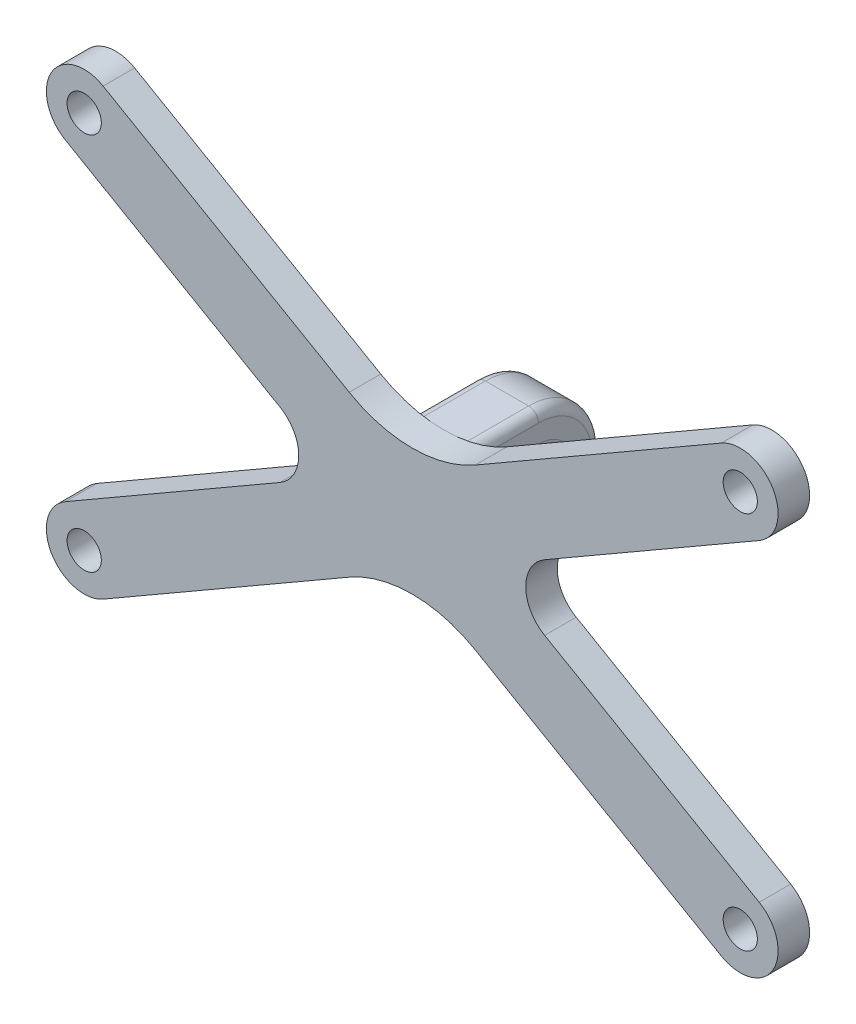
ISO-10303-21;
HEADER;
FILE_DESCRIPTION(('STEP AP214'),'2;1');
FILE_NAME('part.step','',(''),(''),'','','');
FILE_SCHEMA(('AUTOMOTIVE_DESIGN { 1 0 10303 214 1 1 1 1 }'));
ENDSEC;
DATA;
#1=APPLICATION_CONTEXT('core data for automotive mechanical design processes');
#2=APPLICATION_PROTOCOL_DEFINITION('international standard','automotive_design',2000,#1);
#3=PRODUCT_CONTEXT('',#1,'mechanical');
#4=PRODUCT('Part','Part','',(#3));
#5=PRODUCT_RELATED_PRODUCT_CATEGORY('part','',(#4));
#6=PRODUCT_DEFINITION_FORMATION('','',#4);
#7=PRODUCT_DEFINITION_CONTEXT('part definition',#1,'design');
#8=PRODUCT_DEFINITION('design','',#6,#7);
#9=PRODUCT_DEFINITION_SHAPE('','',#8);
#10=(LENGTH_UNIT() NAMED_UNIT(*) SI_UNIT(.MILLI.,.METRE.));
#11=(NAMED_UNIT(*) PLANE_ANGLE_UNIT() SI_UNIT($,.RADIAN.));
#12=(NAMED_UNIT(*) SI_UNIT($,.STERADIAN.) SOLID_ANGLE_UNIT());
#13=UNCERTAINTY_MEASURE_WITH_UNIT(LENGTH_MEASURE(1.E-05),#10,'distance_accuracy_value','');
#14=(GEOMETRIC_REPRESENTATION_CONTEXT(3) GLOBAL_UNCERTAINTY_ASSIGNED_CONTEXT((#13)) GLOBAL_UNIT_ASSIGNED_CONTEXT((#10,
#11,#12)) REPRESENTATION_CONTEXT('',''));
#15=CARTESIAN_POINT('',(0.,0.,0.));
#16=DIRECTION('',(0.,0.,1.));
#17=DIRECTION('',(1.,0.,0.));
#18=AXIS2_PLACEMENT_3D('',#15,#16,#17);
#19=CARTESIAN_POINT('',(33.0388691543761,19.0750000000004,-24.175));
#20=DIRECTION('',(0.,0.,-1.));
#21=DIRECTION('',(-1.,0.,0.));
#22=AXIS2_PLACEMENT_3D('',#19,#20,#21);
#23=PLANE('',#22);
#24=DIRECTION('',(-1.,0.,0.));
#25=VECTOR('',#24,1.);
#26=CARTESIAN_POINT('',(3.175,-6.36410588864129,-24.175));
#27=LINE('',#26,#25);
#28=CARTESIAN_POINT('',(1.07552855510562E-13,-6.36410588864129,-24.175));
#29=VERTEX_POINT('',#28);
#30=CARTESIAN_POINT('',(-2.175,-6.36410588864129,-24.175));
#31=VERTEX_POINT('',#30);
#32=EDGE_CURVE('E219',#29,#31,#27,.T.);
#33=ORIENTED_EDGE('',*,*,#32,.F.);
#34=CARTESIAN_POINT('',(1.07552855510562E-13,-19.0641058886413,-24.175));
#35=DIRECTION('',(0.,0.,-1.));
#36=DIRECTION('',(-1.,0.,0.));
#37=AXIS2_PLACEMENT_3D('',#34,#35,#36);
#38=CIRCLE('',#37,12.7);
#39=CARTESIAN_POINT('',(-6.34999999999999,-8.06558326057897,-24.175));
#40=VERTEX_POINT('',#39);
#41=EDGE_CURVE('E233',#29,#40,#38,.F.);
#42=ORIENTED_EDGE('',*,*,#41,.T.);
#43=DIRECTION('',(-0.866025403784434,-0.500000000000008,0.));
#44=VECTOR('',#43,1.);
#45=CARTESIAN_POINT('',(0.,-4.39940905122478,-24.175));
#46=LINE('',#45,#44);
#47=CARTESIAN_POINT('',(-31.133869154376,-22.3745567884194,-24.175));
#48=VERTEX_POINT('',#47);
#49=EDGE_CURVE('E515',#40,#48,#46,.T.);
#50=ORIENTED_EDGE('',*,*,#49,.T.);
#51=CARTESIAN_POINT('',(-33.0388691543763,-19.0750000000002,-24.175));
#52=DIRECTION('',(0.,0.,-1.));
#53=DIRECTION('',(-1.,0.,0.));
#54=AXIS2_PLACEMENT_3D('',#51,#52,#53);
#55=CIRCLE('',#54,3.81000000000056);
#56=CARTESIAN_POINT('',(-34.9438691543767,-15.7754432115804,-24.175));
#57=VERTEX_POINT('',#56);
#58=EDGE_CURVE('E512',#48,#57,#55,.T.);
#59=ORIENTED_EDGE('',*,*,#58,.T.);
#60=DIRECTION('',(0.866025403784449,0.499999999999982,0.));
#61=VECTOR('',#60,1.);
#62=CARTESIAN_POINT('',(-7.62000000000017,2.14840589410959E-13,-24.175));
#63=LINE('',#62,#61);
#64=CARTESIAN_POINT('',(-13.3350000000004,-3.29955678841848,-24.175));
#65=VERTEX_POINT('',#64);
#66=EDGE_CURVE('E509',#57,#65,#63,.T.);
#67=ORIENTED_EDGE('',*,*,#66,.T.);
#68=CARTESIAN_POINT('',(-15.2400000000004,2.72785266597353E-13,-24.175));
#69=DIRECTION('',(0.,0.,-1.));
#70=DIRECTION('',(-1.,0.,0.));
#71=AXIS2_PLACEMENT_3D('',#68,#69,#70);
#72=CIRCLE('',#71,3.81);
#73=CARTESIAN_POINT('',(-13.3350000000004,3.299556788419,-24.175));
#74=VERTEX_POINT('',#73);
#75=EDGE_CURVE('E373',#65,#74,#72,.F.);
#76=ORIENTED_EDGE('',*,*,#75,.T.);
#77=DIRECTION('',(-0.866025403784442,0.499999999999995,0.));
#78=VECTOR('',#77,1.);
#79=CARTESIAN_POINT('',(-7.62000000000017,2.14840589410959E-13,-24.175));
#80=LINE('',#79,#78);
#81=CARTESIAN_POINT('',(-34.9438691543764,15.7754432115812,-24.175));
#82=VERTEX_POINT('',#81);
#83=EDGE_CURVE('E506',#74,#82,#80,.T.);
#84=ORIENTED_EDGE('',*,*,#83,.T.);
#85=CARTESIAN_POINT('',(-33.0388691543764,19.0749999999999,-24.175));
#86=DIRECTION('',(0.,0.,-1.));
#87=DIRECTION('',(-1.,0.,0.));
#88=AXIS2_PLACEMENT_3D('',#85,#86,#87);
#89=CIRCLE('',#88,3.81);
#90=CARTESIAN_POINT('',(-31.1338691543765,22.3745567884187,-24.175));
#91=VERTEX_POINT('',#90);
#92=EDGE_CURVE('E503',#82,#91,#89,.T.);
#93=ORIENTED_EDGE('',*,*,#92,.T.);
#94=DIRECTION('',(0.866025403784442,-0.499999999999995,0.));
#95=VECTOR('',#94,1.);
#96=CARTESIAN_POINT('',(0.,4.39940905122509,-24.175));
#97=LINE('',#96,#95);
#98=CARTESIAN_POINT('',(-6.34999999999983,8.06558326057906,-24.175));
#99=VERTEX_POINT('',#98);
#100=EDGE_CURVE('E354',#91,#99,#97,.T.);
#101=ORIENTED_EDGE('',*,*,#100,.T.);
#102=CARTESIAN_POINT('',(1.07552855510562E-13,19.0641058886415,-24.175));
#103=DIRECTION('',(0.,0.,-1.));
#104=DIRECTION('',(-1.,0.,0.));
#105=AXIS2_PLACEMENT_3D('',#102,#103,#104);
#106=CIRCLE('',#105,12.7);
#107=CARTESIAN_POINT('',(1.07552855510562E-13,6.36410588864147,-24.175));
#108=VERTEX_POINT('',#107);
#109=EDGE_CURVE('E352',#99,#108,#106,.F.);
#110=ORIENTED_EDGE('',*,*,#109,.T.);
#111=DIRECTION('',(-1.,0.,0.));
#112=VECTOR('',#111,1.);
#113=CARTESIAN_POINT('',(3.175,6.36410588864147,-24.175));
#114=LINE('',#113,#112);
#115=CARTESIAN_POINT('',(-2.175,6.36410588864147,-24.175));
#116=VERTEX_POINT('',#115);
#117=EDGE_CURVE('E239',#108,#116,#114,.T.);
#118=ORIENTED_EDGE('',*,*,#117,.T.);
#119=CARTESIAN_POINT('',(-2.175,5.36410588864147,-24.175));
#120=DIRECTION('',(0.,0.,-1.));
#121=DIRECTION('',(-1.,0.,0.));
#122=AXIS2_PLACEMENT_3D('',#119,#120,#121);
#123=CIRCLE('',#122,1.);
#124=CARTESIAN_POINT('',(-3.175,5.36410588864147,-24.175));
#125=VERTEX_POINT('',#124);
#126=EDGE_CURVE('E12',#116,#125,#123,.F.);
#127=ORIENTED_EDGE('',*,*,#126,.T.);
#128=DIRECTION('',(0.,-1.,0.));
#129=VECTOR('',#128,1.);
#130=CARTESIAN_POINT('',(-3.175,-6.36410588864129,-24.175));
#131=LINE('',#130,#129);
#132=CARTESIAN_POINT('',(-3.175,-5.36410588864129,-24.175));
#133=VERTEX_POINT('',#132);
#134=EDGE_CURVE('E327',#125,#133,#131,.T.);
#135=ORIENTED_EDGE('',*,*,#134,.T.);
#136=CARTESIAN_POINT('',(-2.175,-5.36410588864129,-24.175));
#137=DIRECTION('',(0.,0.,-1.));
#138=DIRECTION('',(-1.,0.,0.));
#139=AXIS2_PLACEMENT_3D('',#136,#137,#138);
#140=CIRCLE('',#139,1.);
#141=EDGE_CURVE('E55',#133,#31,#140,.F.);
#142=ORIENTED_EDGE('',*,*,#141,.T.);
#143=EDGE_LOOP('',(#33,#42,#50,#59,#67,#76,#84,#93,#101,#110,#118,#127,#135,#142));
#144=FACE_BOUND('',#143,.T.);
#145=CARTESIAN_POINT('',(-33.0388691543764,19.0749999999999,-24.175));
#146=DIRECTION('',(0.,0.,-1.));
#147=DIRECTION('',(-1.,0.,0.));
#148=AXIS2_PLACEMENT_3D('',#145,#146,#147);
#149=CIRCLE('',#148,1.7232);
#150=CARTESIAN_POINT('',(-34.7620691543764,19.0749999999999,-24.175));
#151=VERTEX_POINT('',#150);
#152=EDGE_CURVE('E545',#151,#151,#149,.T.);
#153=ORIENTED_EDGE('',*,*,#152,.F.);
#154=EDGE_LOOP('',(#153));
#155=FACE_BOUND('',#154,.T.);
#156=CARTESIAN_POINT('',(-33.0388691543763,-19.0750000000002,-24.175));
#157=DIRECTION('',(0.,0.,-1.));
#158=DIRECTION('',(-1.,0.,0.));
#159=AXIS2_PLACEMENT_3D('',#156,#157,#158);
#160=CIRCLE('',#159,1.72320000000001);
#161=CARTESIAN_POINT('',(-34.7620691543763,-19.0750000000002,-24.175));
#162=VERTEX_POINT('',#161);
#163=EDGE_CURVE('E491',#162,#162,#160,.T.);
#164=ORIENTED_EDGE('',*,*,#163,.F.);
#165=EDGE_LOOP('',(#164));
#166=FACE_BOUND('',#165,.T.);
#167=ADVANCED_FACE('F45',(#144,#155,#166),#23,.T.);
#168=CARTESIAN_POINT('',(2.175,-6.36410588864129,-24.175));
#169=VERTEX_POINT('',#168);
#170=EDGE_CURVE('E214',#169,#29,#27,.T.);
#171=ORIENTED_EDGE('',*,*,#170,.F.);
#172=CARTESIAN_POINT('',(2.175,-5.36410588864129,-24.175));
#173=DIRECTION('',(0.,0.,-1.));
#174=DIRECTION('',(-1.,0.,0.));
#175=AXIS2_PLACEMENT_3D('',#172,#173,#174);
#176=CIRCLE('',#175,1.);
#177=CARTESIAN_POINT('',(3.175,-5.36410588864129,-24.175));
#178=VERTEX_POINT('',#177);
#179=EDGE_CURVE('E313',#169,#178,#176,.F.);
#180=ORIENTED_EDGE('',*,*,#179,.T.);
#181=DIRECTION('',(0.,-1.,0.));
#182=VECTOR('',#181,1.);
#183=CARTESIAN_POINT('',(3.175,-6.36410588864129,-24.175));
#184=LINE('',#183,#182);
#185=CARTESIAN_POINT('',(3.175,5.36410588864147,-24.175));
#186=VERTEX_POINT('',#185);
#187=EDGE_CURVE('E561',#186,#178,#184,.T.);
#188=ORIENTED_EDGE('',*,*,#187,.F.);
#189=CARTESIAN_POINT('',(2.175,5.36410588864147,-24.175));
#190=DIRECTION('',(0.,0.,-1.));
#191=DIRECTION('',(-1.,0.,0.));
#192=AXIS2_PLACEMENT_3D('',#189,#190,#191);
#193=CIRCLE('',#192,1.);
#194=CARTESIAN_POINT('',(2.175,6.36410588864147,-24.175));
#195=VERTEX_POINT('',#194);
#196=EDGE_CURVE('E316',#186,#195,#193,.F.);
#197=ORIENTED_EDGE('',*,*,#196,.T.);
#198=EDGE_CURVE('E260',#195,#108,#114,.T.);
#199=ORIENTED_EDGE('',*,*,#198,.T.);
#200=CARTESIAN_POINT('',(6.34999999999988,8.06558326057897,-24.175));
#201=VERTEX_POINT('',#200);
#202=EDGE_CURVE('E359',#108,#201,#106,.F.);
#203=ORIENTED_EDGE('',*,*,#202,.T.);
#204=DIRECTION('',(0.866025403784449,0.499999999999982,0.));
#205=VECTOR('',#204,1.);
#206=CARTESIAN_POINT('',(31.1338691543767,22.3745567884182,-24.175));
#207=LINE('',#206,#205);
#208=CARTESIAN_POINT('',(31.1338691543765,22.3745567884187,-24.175));
#209=VERTEX_POINT('',#208);
#210=EDGE_CURVE('E498',#201,#209,#207,.T.);
#211=ORIENTED_EDGE('',*,*,#210,.T.);
#212=CARTESIAN_POINT('',(33.0388691543761,19.0750000000004,-24.175));
#213=DIRECTION('',(0.,0.,-1.));
#214=DIRECTION('',(-1.,0.,0.));
#215=AXIS2_PLACEMENT_3D('',#212,#213,#214);
#216=CIRCLE('',#215,3.80999999999944);
#217=CARTESIAN_POINT('',(34.9438691543761,15.7754432115817,-24.175));
#218=VERTEX_POINT('',#217);
#219=EDGE_CURVE('E495',#209,#218,#216,.T.);
#220=ORIENTED_EDGE('',*,*,#219,.T.);
#221=DIRECTION('',(-0.866025403784434,-0.500000000000008,0.));
#222=VECTOR('',#221,1.);
#223=CARTESIAN_POINT('',(34.9438691543761,15.7754432115817,-24.175));
#224=LINE('',#223,#222);
#225=CARTESIAN_POINT('',(13.3349999999999,3.29955678841897,-24.175));
#226=VERTEX_POINT('',#225);
#227=EDGE_CURVE('E455',#218,#226,#224,.T.);
#228=ORIENTED_EDGE('',*,*,#227,.T.);
#229=CARTESIAN_POINT('',(15.2399999999999,2.70616862252382E-13,-24.175));
#230=DIRECTION('',(0.,0.,-1.));
#231=DIRECTION('',(-1.,0.,0.));
#232=AXIS2_PLACEMENT_3D('',#229,#230,#231);
#233=CIRCLE('',#232,3.81);
#234=CARTESIAN_POINT('',(13.335,-3.29955678841845,-24.175));
#235=VERTEX_POINT('',#234);
#236=EDGE_CURVE('E363',#226,#235,#233,.F.);
#237=ORIENTED_EDGE('',*,*,#236,.T.);
#238=DIRECTION('',(0.866025403784442,-0.499999999999995,0.));
#239=VECTOR('',#238,1.);
#240=CARTESIAN_POINT('',(34.9438691543765,-15.775443211581,-24.175));
#241=LINE('',#240,#239);
#242=CARTESIAN_POINT('',(34.9438691543765,-15.775443211581,-24.175));
#243=VERTEX_POINT('',#242);
#244=EDGE_CURVE('E460',#235,#243,#241,.T.);
#245=ORIENTED_EDGE('',*,*,#244,.T.);
#246=CARTESIAN_POINT('',(33.0388691543765,-19.0749999999997,-24.175));
#247=DIRECTION('',(0.,0.,-1.));
#248=DIRECTION('',(-1.,0.,0.));
#249=AXIS2_PLACEMENT_3D('',#246,#247,#248);
#250=CIRCLE('',#249,3.81);
#251=CARTESIAN_POINT('',(31.1338691543765,-22.3745567884184,-24.175));
#252=VERTEX_POINT('',#251);
#253=EDGE_CURVE('E520',#243,#252,#250,.T.);
#254=ORIENTED_EDGE('',*,*,#253,.T.);
#255=DIRECTION('',(-0.866025403784442,0.499999999999995,0.));
#256=VECTOR('',#255,1.);
#257=CARTESIAN_POINT('',(31.1338691543765,-22.3745567884184,-24.175));
#258=LINE('',#257,#256);
#259=CARTESIAN_POINT('',(6.35000000000004,-8.06558326057888,-24.175));
#260=VERTEX_POINT('',#259);
#261=EDGE_CURVE('E255',#252,#260,#258,.T.);
#262=ORIENTED_EDGE('',*,*,#261,.T.);
#263=EDGE_CURVE('E245',#260,#29,#38,.F.);
#264=ORIENTED_EDGE('',*,*,#263,.T.);
#265=EDGE_LOOP('',(#171,#180,#188,#197,#199,#203,#211,#220,#228,#237,#245,#254,#262,#264));
#266=FACE_BOUND('',#265,.T.);
#267=CARTESIAN_POINT('',(33.0388691543761,19.0750000000004,-24.175));
#268=DIRECTION('',(0.,0.,-1.));
#269=DIRECTION('',(-1.,0.,0.));
#270=AXIS2_PLACEMENT_3D('',#267,#268,#269);
#271=CIRCLE('',#270,1.7232);
#272=CARTESIAN_POINT('',(31.3156691543761,19.0750000000004,-24.175));
#273=VERTEX_POINT('',#272);
#274=EDGE_CURVE('E537',#273,#273,#271,.T.);
#275=ORIENTED_EDGE('',*,*,#274,.F.);
#276=EDGE_LOOP('',(#275));
#277=FACE_BOUND('',#276,.T.);
#278=CARTESIAN_POINT('',(33.0388691543765,-19.0749999999997,-24.175));
#279=DIRECTION('',(0.,0.,-1.));
#280=DIRECTION('',(-1.,0.,0.));
#281=AXIS2_PLACEMENT_3D('',#278,#279,#280);
#282=CIRCLE('',#281,1.7232);
#283=CARTESIAN_POINT('',(31.3156691543765,-19.0749999999997,-24.175));
#284=VERTEX_POINT('',#283);
#285=EDGE_CURVE('E529',#284,#284,#282,.T.);
#286=ORIENTED_EDGE('',*,*,#285,.F.);
#287=EDGE_LOOP('',(#286));
#288=FACE_BOUND('',#287,.T.);
#289=ADVANCED_FACE('F252',(#266,#277,#288),#23,.T.);
#290=CARTESIAN_POINT('',(33.0388691543761,19.0750000000004,-21.));
#291=DIRECTION('',(0.,0.,-1.));
#292=DIRECTION('',(-1.,0.,0.));
#293=AXIS2_PLACEMENT_3D('',#290,#291,#292);
#294=PLANE('',#293);
#295=DIRECTION('',(0.866025403784442,-0.499999999999995,0.));
#296=VECTOR('',#295,1.);
#297=CARTESIAN_POINT('',(34.9438691543765,-15.775443211581,-21.));
#298=LINE('',#297,#296);
#299=CARTESIAN_POINT('',(13.335,-3.29955678841845,-21.));
#300=VERTEX_POINT('',#299);
#301=CARTESIAN_POINT('',(34.9438691543765,-15.775443211581,-21.));
#302=VERTEX_POINT('',#301);
#303=EDGE_CURVE('E488',#300,#302,#298,.T.);
#304=ORIENTED_EDGE('',*,*,#303,.F.);
#305=CARTESIAN_POINT('',(15.2399999999999,2.70616862252382E-13,-21.));
#306=DIRECTION('',(0.,0.,-1.));
#307=DIRECTION('',(-1.,0.,0.));
#308=AXIS2_PLACEMENT_3D('',#305,#306,#307);
#309=CIRCLE('',#308,3.81);
#310=CARTESIAN_POINT('',(13.3349999999999,3.29955678841897,-21.));
#311=VERTEX_POINT('',#310);
#312=EDGE_CURVE('E358',#300,#311,#309,.T.);
#313=ORIENTED_EDGE('',*,*,#312,.T.);
#314=DIRECTION('',(-0.866025403784434,-0.500000000000008,0.));
#315=VECTOR('',#314,1.);
#316=CARTESIAN_POINT('',(34.9438691543761,15.7754432115817,-21.));
#317=LINE('',#316,#315);
#318=CARTESIAN_POINT('',(34.9438691543761,15.7754432115817,-21.));
#319=VERTEX_POINT('',#318);
#320=EDGE_CURVE('E456',#319,#311,#317,.T.);
#321=ORIENTED_EDGE('',*,*,#320,.F.);
#322=CARTESIAN_POINT('',(33.0388691543761,19.0750000000004,-21.));
#323=DIRECTION('',(0.,0.,-1.));
#324=DIRECTION('',(-1.,0.,0.));
#325=AXIS2_PLACEMENT_3D('',#322,#323,#324);
#326=CIRCLE('',#325,3.80999999999944);
#327=CARTESIAN_POINT('',(31.1338691543765,22.3745567884187,-21.));
#328=VERTEX_POINT('',#327);
#329=EDGE_CURVE('E461',#328,#319,#326,.T.);
#330=ORIENTED_EDGE('',*,*,#329,.F.);
#331=DIRECTION('',(0.866025403784449,0.499999999999982,0.));
#332=VECTOR('',#331,1.);
#333=CARTESIAN_POINT('',(31.1338691543767,22.3745567884182,-21.));
#334=LINE('',#333,#332);
#335=CARTESIAN_POINT('',(6.34999999999988,8.06558326057897,-21.));
#336=VERTEX_POINT('',#335);
#337=EDGE_CURVE('E464',#336,#328,#334,.T.);
#338=ORIENTED_EDGE('',*,*,#337,.F.);
#339=CARTESIAN_POINT('',(1.07552855510562E-13,19.0641058886415,-21.));
#340=DIRECTION('',(0.,0.,-1.));
#341=DIRECTION('',(-1.,0.,0.));
#342=AXIS2_PLACEMENT_3D('',#339,#340,#341);
#343=CIRCLE('',#342,12.7);
#344=CARTESIAN_POINT('',(-6.34999999999983,8.06558326057906,-21.));
#345=VERTEX_POINT('',#344);
#346=EDGE_CURVE('E365',#336,#345,#343,.T.);
#347=ORIENTED_EDGE('',*,*,#346,.T.);
#348=DIRECTION('',(0.866025403784442,-0.499999999999995,0.));
#349=VECTOR('',#348,1.);
#350=CARTESIAN_POINT('',(0.,4.39940905122509,-21.));
#351=LINE('',#350,#349);
#352=CARTESIAN_POINT('',(-31.1338691543765,22.3745567884187,-21.));
#353=VERTEX_POINT('',#352);
#354=EDGE_CURVE('E467',#353,#345,#351,.T.);
#355=ORIENTED_EDGE('',*,*,#354,.F.);
#356=CARTESIAN_POINT('',(-33.0388691543764,19.0749999999999,-21.));
#357=DIRECTION('',(0.,0.,-1.));
#358=DIRECTION('',(-1.,0.,0.));
#359=AXIS2_PLACEMENT_3D('',#356,#357,#358);
#360=CIRCLE('',#359,3.81);
#361=CARTESIAN_POINT('',(-34.9438691543764,15.7754432115812,-21.));
#362=VERTEX_POINT('',#361);
#363=EDGE_CURVE('E471',#362,#353,#360,.T.);
#364=ORIENTED_EDGE('',*,*,#363,.F.);
#365=DIRECTION('',(-0.866025403784442,0.499999999999995,0.));
#366=VECTOR('',#365,1.);
#367=CARTESIAN_POINT('',(-7.62000000000017,2.14840589410959E-13,-21.));
#368=LINE('',#367,#366);
#369=CARTESIAN_POINT('',(-13.3350000000004,3.299556788419,-21.));
#370=VERTEX_POINT('',#369);
#371=EDGE_CURVE('E474',#370,#362,#368,.T.);
#372=ORIENTED_EDGE('',*,*,#371,.F.);
#373=CARTESIAN_POINT('',(-15.2400000000004,2.72785266597353E-13,-21.));
#374=DIRECTION('',(0.,0.,-1.));
#375=DIRECTION('',(-1.,0.,0.));
#376=AXIS2_PLACEMENT_3D('',#373,#374,#375);
#377=CIRCLE('',#376,3.81);
#378=CARTESIAN_POINT('',(-13.3350000000004,-3.29955678841848,-21.));
#379=VERTEX_POINT('',#378);
#380=EDGE_CURVE('E371',#370,#379,#377,.T.);
#381=ORIENTED_EDGE('',*,*,#380,.T.);
#382=DIRECTION('',(0.866025403784449,0.499999999999982,0.));
#383=VECTOR('',#382,1.);
#384=CARTESIAN_POINT('',(-7.62000000000017,2.14840589410959E-13,-21.));
#385=LINE('',#384,#383);
#386=CARTESIAN_POINT('',(-34.9438691543767,-15.7754432115804,-21.));
#387=VERTEX_POINT('',#386);
#388=EDGE_CURVE('E477',#387,#379,#385,.T.);
#389=ORIENTED_EDGE('',*,*,#388,.F.);
#390=CARTESIAN_POINT('',(-33.0388691543763,-19.0750000000002,-21.));
#391=DIRECTION('',(0.,0.,-1.));
#392=DIRECTION('',(-1.,0.,0.));
#393=AXIS2_PLACEMENT_3D('',#390,#391,#392);
#394=CIRCLE('',#393,3.81000000000056);
#395=CARTESIAN_POINT('',(-31.133869154376,-22.3745567884194,-21.));
#396=VERTEX_POINT('',#395);
#397=EDGE_CURVE('E481',#396,#387,#394,.T.);
#398=ORIENTED_EDGE('',*,*,#397,.F.);
#399=DIRECTION('',(-0.866025403784434,-0.500000000000008,0.));
#400=VECTOR('',#399,1.);
#401=CARTESIAN_POINT('',(0.,-4.39940905122478,-21.));
#402=LINE('',#401,#400);
#403=CARTESIAN_POINT('',(-6.34999999999999,-8.06558326057897,-21.));
#404=VERTEX_POINT('',#403);
#405=EDGE_CURVE('E389',#404,#396,#402,.T.);
#406=ORIENTED_EDGE('',*,*,#405,.F.);
#407=CARTESIAN_POINT('',(1.07552855510562E-13,-19.0641058886413,-21.));
#408=DIRECTION('',(0.,0.,-1.));
#409=DIRECTION('',(-1.,0.,0.));
#410=AXIS2_PLACEMENT_3D('',#407,#408,#409);
#411=CIRCLE('',#410,12.7);
#412=CARTESIAN_POINT('',(6.35000000000004,-8.06558326057888,-21.));
#413=VERTEX_POINT('',#412);
#414=EDGE_CURVE('E249',#404,#413,#411,.T.);
#415=ORIENTED_EDGE('',*,*,#414,.T.);
#416=DIRECTION('',(-0.866025403784442,0.499999999999995,0.));
#417=VECTOR('',#416,1.);
#418=CARTESIAN_POINT('',(31.1338691543765,-22.3745567884184,-21.));
#419=LINE('',#418,#417);
#420=CARTESIAN_POINT('',(31.1338691543765,-22.3745567884184,-21.));
#421=VERTEX_POINT('',#420);
#422=EDGE_CURVE('E387',#421,#413,#419,.T.);
#423=ORIENTED_EDGE('',*,*,#422,.F.);
#424=CARTESIAN_POINT('',(33.0388691543765,-19.0749999999997,-21.));
#425=DIRECTION('',(0.,0.,-1.));
#426=DIRECTION('',(-1.,0.,0.));
#427=AXIS2_PLACEMENT_3D('',#424,#425,#426);
#428=CIRCLE('',#427,3.81);
#429=EDGE_CURVE('E397',#302,#421,#428,.T.);
#430=ORIENTED_EDGE('',*,*,#429,.F.);
#431=EDGE_LOOP('',(#304,#313,#321,#330,#338,#347,#355,#364,#372,#381,#389,#398,#406,#415,#423,#430));
#432=FACE_BOUND('',#431,.T.);
#433=CARTESIAN_POINT('',(-33.0388691543763,-19.0750000000002,-21.));
#434=DIRECTION('',(0.,0.,-1.));
#435=DIRECTION('',(-1.,0.,0.));
#436=AXIS2_PLACEMENT_3D('',#433,#434,#435);
#437=CIRCLE('',#436,1.72320000000001);
#438=CARTESIAN_POINT('',(-34.7620691543763,-19.0750000000002,-21.));
#439=VERTEX_POINT('',#438);
#440=EDGE_CURVE('E525',#439,#439,#437,.T.);
#441=ORIENTED_EDGE('',*,*,#440,.T.);
#442=EDGE_LOOP('',(#441));
#443=FACE_BOUND('',#442,.T.);
#444=CARTESIAN_POINT('',(33.0388691543765,-19.0749999999997,-21.));
#445=DIRECTION('',(0.,0.,-1.));
#446=DIRECTION('',(-1.,0.,0.));
#447=AXIS2_PLACEMENT_3D('',#444,#445,#446);
#448=CIRCLE('',#447,1.7232);
#449=CARTESIAN_POINT('',(31.3156691543765,-19.0749999999997,-21.));
#450=VERTEX_POINT('',#449);
#451=EDGE_CURVE('E533',#450,#450,#448,.T.);
#452=ORIENTED_EDGE('',*,*,#451,.T.);
#453=EDGE_LOOP('',(#452));
#454=FACE_BOUND('',#453,.T.);
#455=CARTESIAN_POINT('',(33.0388691543761,19.0750000000004,-21.));
#456=DIRECTION('',(0.,0.,-1.));
#457=DIRECTION('',(-1.,0.,0.));
#458=AXIS2_PLACEMENT_3D('',#455,#456,#457);
#459=CIRCLE('',#458,1.7232);
#460=CARTESIAN_POINT('',(31.3156691543761,19.0750000000004,-21.));
#461=VERTEX_POINT('',#460);
#462=EDGE_CURVE('E541',#461,#461,#459,.T.);
#463=ORIENTED_EDGE('',*,*,#462,.T.);
#464=EDGE_LOOP('',(#463));
#465=FACE_BOUND('',#464,.T.);
#466=CARTESIAN_POINT('',(-33.0388691543764,19.0749999999999,-21.));
#467=DIRECTION('',(0.,0.,-1.));
#468=DIRECTION('',(-1.,0.,0.));
#469=AXIS2_PLACEMENT_3D('',#466,#467,#468);
#470=CIRCLE('',#469,1.7232);
#471=CARTESIAN_POINT('',(-34.7620691543764,19.0749999999999,-21.));
#472=VERTEX_POINT('',#471);
#473=EDGE_CURVE('E227',#472,#472,#470,.T.);
#474=ORIENTED_EDGE('',*,*,#473,.T.);
#475=EDGE_LOOP('',(#474));
#476=FACE_BOUND('',#475,.T.);
#477=ADVANCED_FACE('F384',(#432,#443,#454,#465,#476),#294,.F.);
#478=CARTESIAN_POINT('',(34.9438691543765,-15.775443211581,-24.175));
#479=DIRECTION('',(-0.499999999999995,-0.866025403784442,0.));
#480=DIRECTION('',(0.866025403784442,-0.499999999999995,0.));
#481=AXIS2_PLACEMENT_3D('',#478,#479,#480);
#482=PLANE('',#481);
#483=ORIENTED_EDGE('',*,*,#244,.F.);
#484=DIRECTION('',(0.,0.,1.));
#485=VECTOR('',#484,1.);
#486=CARTESIAN_POINT('',(13.335,-3.29955678841845,-21.));
#487=LINE('',#486,#485);
#488=EDGE_CURVE('E414',#235,#300,#487,.T.);
#489=ORIENTED_EDGE('',*,*,#488,.T.);
#490=ORIENTED_EDGE('',*,*,#303,.T.);
#491=DIRECTION('',(0.,0.,1.));
#492=VECTOR('',#491,1.);
#493=CARTESIAN_POINT('',(34.9438691543765,-15.775443211581,-24.175));
#494=LINE('',#493,#492);
#495=EDGE_CURVE('E425',#243,#302,#494,.T.);
#496=ORIENTED_EDGE('',*,*,#495,.F.);
#497=EDGE_LOOP('',(#483,#489,#490,#496));
#498=FACE_BOUND('',#497,.T.);
#499=ADVANCED_FACE('F609',(#498),#482,.F.);
#500=CARTESIAN_POINT('',(33.0388691543765,-19.0749999999997,-24.175));
#501=DIRECTION('',(0.,0.,1.));
#502=DIRECTION('',(1.,0.,0.));
#503=AXIS2_PLACEMENT_3D('',#500,#501,#502);
#504=CYLINDRICAL_SURFACE('',#503,3.81);
#505=ORIENTED_EDGE('',*,*,#429,.T.);
#506=DIRECTION('',(0.,0.,1.));
#507=VECTOR('',#506,1.);
#508=CARTESIAN_POINT('',(31.1338691543765,-22.3745567884184,-24.175));
#509=LINE('',#508,#507);
#510=EDGE_CURVE('E395',#252,#421,#509,.T.);
#511=ORIENTED_EDGE('',*,*,#510,.F.);
#512=ORIENTED_EDGE('',*,*,#253,.F.);
#513=ORIENTED_EDGE('',*,*,#495,.T.);
#514=EDGE_LOOP('',(#505,#511,#512,#513));
#515=FACE_BOUND('',#514,.T.);
#516=ADVANCED_FACE('F648',(#515),#504,.T.);
#517=CARTESIAN_POINT('',(31.1338691543765,-22.3745567884184,-24.175));
#518=DIRECTION('',(0.499999999999995,0.866025403784442,0.));
#519=DIRECTION('',(-0.866025403784442,0.499999999999995,0.));
#520=AXIS2_PLACEMENT_3D('',#517,#518,#519);
#521=PLANE('',#520);
#522=ORIENTED_EDGE('',*,*,#422,.T.);
#523=DIRECTION('',(0.,0.,1.));
#524=VECTOR('',#523,1.);
#525=CARTESIAN_POINT('',(6.35000000000004,-8.06558326057888,-24.175));
#526=LINE('',#525,#524);
#527=EDGE_CURVE('E393',#413,#260,#526,.F.);
#528=ORIENTED_EDGE('',*,*,#527,.T.);
#529=ORIENTED_EDGE('',*,*,#261,.F.);
#530=ORIENTED_EDGE('',*,*,#510,.T.);
#531=EDGE_LOOP('',(#522,#528,#529,#530));
#532=FACE_BOUND('',#531,.T.);
#533=ADVANCED_FACE('F392',(#532),#521,.F.);
#534=CARTESIAN_POINT('',(0.,-4.39940905122478,-24.175));
#535=DIRECTION('',(-0.500000000000008,0.866025403784434,0.));
#536=DIRECTION('',(-0.866025403784434,-0.500000000000008,0.));
#537=AXIS2_PLACEMENT_3D('',#534,#535,#536);
#538=PLANE('',#537);
#539=ORIENTED_EDGE('',*,*,#49,.F.);
#540=DIRECTION('',(0.,0.,1.));
#541=VECTOR('',#540,1.);
#542=CARTESIAN_POINT('',(-6.34999999999999,-8.06558326057898,-21.));
#543=LINE('',#542,#541);
#544=EDGE_CURVE('E247',#40,#404,#543,.T.);
#545=ORIENTED_EDGE('',*,*,#544,.T.);
#546=ORIENTED_EDGE('',*,*,#405,.T.);
#547=DIRECTION('',(0.,0.,1.));
#548=VECTOR('',#547,1.);
#549=CARTESIAN_POINT('',(-31.133869154376,-22.3745567884194,-24.175));
#550=LINE('',#549,#548);
#551=EDGE_CURVE('E431',#48,#396,#550,.T.);
#552=ORIENTED_EDGE('',*,*,#551,.F.);
#553=EDGE_LOOP('',(#539,#545,#546,#552));
#554=FACE_BOUND('',#553,.T.);
#555=ADVANCED_FACE('F641',(#554),#538,.F.);
#556=CARTESIAN_POINT('',(-33.0388691543763,-19.0750000000002,-24.175));
#557=DIRECTION('',(0.,0.,1.));
#558=DIRECTION('',(1.,0.,0.));
#559=AXIS2_PLACEMENT_3D('',#556,#557,#558);
#560=CYLINDRICAL_SURFACE('',#559,3.81000000000056);
#561=ORIENTED_EDGE('',*,*,#397,.T.);
#562=DIRECTION('',(0.,0.,1.));
#563=VECTOR('',#562,1.);
#564=CARTESIAN_POINT('',(-34.9438691543767,-15.7754432115804,-24.175));
#565=LINE('',#564,#563);
#566=EDGE_CURVE('E435',#57,#387,#565,.T.);
#567=ORIENTED_EDGE('',*,*,#566,.F.);
#568=ORIENTED_EDGE('',*,*,#58,.F.);
#569=ORIENTED_EDGE('',*,*,#551,.T.);
#570=EDGE_LOOP('',(#561,#567,#568,#569));
#571=FACE_BOUND('',#570,.T.);
#572=ADVANCED_FACE('F637',(#571),#560,.T.);
#573=CARTESIAN_POINT('',(-7.62000000000017,2.14840589410959E-13,-24.175));
#574=DIRECTION('',(0.499999999999982,-0.866025403784449,0.));
#575=DIRECTION('',(0.866025403784449,0.499999999999982,0.));
#576=AXIS2_PLACEMENT_3D('',#573,#574,#575);
#577=PLANE('',#576);
#578=ORIENTED_EDGE('',*,*,#388,.T.);
#579=DIRECTION('',(0.,0.,1.));
#580=VECTOR('',#579,1.);
#581=CARTESIAN_POINT('',(-13.3350000000004,-3.29955678841848,-24.175));
#582=LINE('',#581,#580);
#583=EDGE_CURVE('E402',#379,#65,#582,.F.);
#584=ORIENTED_EDGE('',*,*,#583,.T.);
#585=ORIENTED_EDGE('',*,*,#66,.F.);
#586=ORIENTED_EDGE('',*,*,#566,.T.);
#587=EDGE_LOOP('',(#578,#584,#585,#586));
#588=FACE_BOUND('',#587,.T.);
#589=ADVANCED_FACE('F633',(#588),#577,.F.);
#590=CARTESIAN_POINT('',(-7.62000000000017,2.14840589410959E-13,-24.175));
#591=DIRECTION('',(0.499999999999995,0.866025403784442,0.));
#592=DIRECTION('',(-0.866025403784442,0.499999999999995,0.));
#593=AXIS2_PLACEMENT_3D('',#590,#591,#592);
#594=PLANE('',#593);
#595=ORIENTED_EDGE('',*,*,#83,.F.);
#596=DIRECTION('',(0.,0.,1.));
#597=VECTOR('',#596,1.);
#598=CARTESIAN_POINT('',(-13.3350000000004,3.29955678841899,-21.));
#599=LINE('',#598,#597);
#600=EDGE_CURVE('E407',#74,#370,#599,.T.);
#601=ORIENTED_EDGE('',*,*,#600,.T.);
#602=ORIENTED_EDGE('',*,*,#371,.T.);
#603=DIRECTION('',(0.,0.,1.));
#604=VECTOR('',#603,1.);
#605=CARTESIAN_POINT('',(-34.9438691543764,15.7754432115812,-24.175));
#606=LINE('',#605,#604);
#607=EDGE_CURVE('E439',#82,#362,#606,.T.);
#608=ORIENTED_EDGE('',*,*,#607,.F.);
#609=EDGE_LOOP('',(#595,#601,#602,#608));
#610=FACE_BOUND('',#609,.T.);
#611=ADVANCED_FACE('F629',(#610),#594,.F.);
#612=CARTESIAN_POINT('',(-33.0388691543764,19.0749999999999,-24.175));
#613=DIRECTION('',(0.,0.,1.));
#614=DIRECTION('',(1.,0.,0.));
#615=AXIS2_PLACEMENT_3D('',#612,#613,#614);
#616=CYLINDRICAL_SURFACE('',#615,3.81);
#617=ORIENTED_EDGE('',*,*,#363,.T.);
#618=DIRECTION('',(0.,0.,1.));
#619=VECTOR('',#618,1.);
#620=CARTESIAN_POINT('',(-31.1338691543765,22.3745567884187,-24.175));
#621=LINE('',#620,#619);
#622=EDGE_CURVE('E443',#91,#353,#621,.T.);
#623=ORIENTED_EDGE('',*,*,#622,.F.);
#624=ORIENTED_EDGE('',*,*,#92,.F.);
#625=ORIENTED_EDGE('',*,*,#607,.T.);
#626=EDGE_LOOP('',(#617,#623,#624,#625));
#627=FACE_BOUND('',#626,.T.);
#628=ADVANCED_FACE('F625',(#627),#616,.T.);
#629=CARTESIAN_POINT('',(0.,4.39940905122509,-24.175));
#630=DIRECTION('',(-0.499999999999995,-0.866025403784442,0.));
#631=DIRECTION('',(0.866025403784442,-0.499999999999995,0.));
#632=AXIS2_PLACEMENT_3D('',#629,#630,#631);
#633=PLANE('',#632);
#634=ORIENTED_EDGE('',*,*,#354,.T.);
#635=DIRECTION('',(0.,0.,1.));
#636=VECTOR('',#635,1.);
#637=CARTESIAN_POINT('',(-6.34999999999982,8.06558326057906,-24.175));
#638=LINE('',#637,#636);
#639=EDGE_CURVE('E418',#345,#99,#638,.F.);
#640=ORIENTED_EDGE('',*,*,#639,.T.);
#641=ORIENTED_EDGE('',*,*,#100,.F.);
#642=ORIENTED_EDGE('',*,*,#622,.T.);
#643=EDGE_LOOP('',(#634,#640,#641,#642));
#644=FACE_BOUND('',#643,.T.);
#645=ADVANCED_FACE('F621',(#644),#633,.F.);
#646=CARTESIAN_POINT('',(31.1338691543767,22.3745567884182,-24.175));
#647=DIRECTION('',(0.499999999999982,-0.866025403784449,0.));
#648=DIRECTION('',(0.866025403784449,0.499999999999982,0.));
#649=AXIS2_PLACEMENT_3D('',#646,#647,#648);
#650=PLANE('',#649);
#651=ORIENTED_EDGE('',*,*,#210,.F.);
#652=DIRECTION('',(0.,0.,1.));
#653=VECTOR('',#652,1.);
#654=CARTESIAN_POINT('',(6.34999999999988,8.06558326057897,-21.));
#655=LINE('',#654,#653);
#656=EDGE_CURVE('E421',#201,#336,#655,.T.);
#657=ORIENTED_EDGE('',*,*,#656,.T.);
#658=ORIENTED_EDGE('',*,*,#337,.T.);
#659=DIRECTION('',(0.,0.,1.));
#660=VECTOR('',#659,1.);
#661=CARTESIAN_POINT('',(31.1338691543765,22.3745567884187,-24.175));
#662=LINE('',#661,#660);
#663=EDGE_CURVE('E447',#209,#328,#662,.T.);
#664=ORIENTED_EDGE('',*,*,#663,.F.);
#665=EDGE_LOOP('',(#651,#657,#658,#664));
#666=FACE_BOUND('',#665,.T.);
#667=ADVANCED_FACE('F617',(#666),#650,.F.);
#668=CARTESIAN_POINT('',(33.0388691543761,19.0750000000004,-24.175));
#669=DIRECTION('',(0.,0.,1.));
#670=DIRECTION('',(1.,0.,0.));
#671=AXIS2_PLACEMENT_3D('',#668,#669,#670);
#672=CYLINDRICAL_SURFACE('',#671,3.80999999999944);
#673=ORIENTED_EDGE('',*,*,#329,.T.);
#674=DIRECTION('',(0.,0.,1.));
#675=VECTOR('',#674,1.);
#676=CARTESIAN_POINT('',(34.9438691543761,15.7754432115817,-24.175));
#677=LINE('',#676,#675);
#678=EDGE_CURVE('E451',#218,#319,#677,.T.);
#679=ORIENTED_EDGE('',*,*,#678,.F.);
#680=ORIENTED_EDGE('',*,*,#219,.F.);
#681=ORIENTED_EDGE('',*,*,#663,.T.);
#682=EDGE_LOOP('',(#673,#679,#680,#681));
#683=FACE_BOUND('',#682,.T.);
#684=ADVANCED_FACE('F613',(#683),#672,.T.);
#685=CARTESIAN_POINT('',(34.9438691543761,15.7754432115817,-24.175));
#686=DIRECTION('',(-0.500000000000008,0.866025403784434,0.));
#687=DIRECTION('',(-0.866025403784434,-0.500000000000008,0.));
#688=AXIS2_PLACEMENT_3D('',#685,#686,#687);
#689=PLANE('',#688);
#690=ORIENTED_EDGE('',*,*,#320,.T.);
#691=DIRECTION('',(0.,0.,1.));
#692=VECTOR('',#691,1.);
#693=CARTESIAN_POINT('',(13.3349999999999,3.29955678841897,-24.175));
#694=LINE('',#693,#692);
#695=EDGE_CURVE('E411',#311,#226,#694,.F.);
#696=ORIENTED_EDGE('',*,*,#695,.T.);
#697=ORIENTED_EDGE('',*,*,#227,.F.);
#698=ORIENTED_EDGE('',*,*,#678,.T.);
#699=EDGE_LOOP('',(#690,#696,#697,#698));
#700=FACE_BOUND('',#699,.T.);
#701=ADVANCED_FACE('F610',(#700),#689,.F.);
#702=CARTESIAN_POINT('',(-33.0388691543763,-19.0750000000002,-24.175));
#703=DIRECTION('',(0.,0.,1.));
#704=DIRECTION('',(1.,0.,0.));
#705=AXIS2_PLACEMENT_3D('',#702,#703,#704);
#706=CYLINDRICAL_SURFACE('',#705,1.72320000000001);
#707=ORIENTED_EDGE('',*,*,#163,.T.);
#708=EDGE_LOOP('',(#707));
#709=FACE_BOUND('',#708,.T.);
#710=ORIENTED_EDGE('',*,*,#440,.F.);
#711=EDGE_LOOP('',(#710));
#712=FACE_BOUND('',#711,.T.);
#713=ADVANCED_FACE('F605',(#709,#712),#706,.F.);
#714=CARTESIAN_POINT('',(33.0388691543765,-19.0749999999997,-24.175));
#715=DIRECTION('',(0.,0.,1.));
#716=DIRECTION('',(1.,0.,0.));
#717=AXIS2_PLACEMENT_3D('',#714,#715,#716);
#718=CYLINDRICAL_SURFACE('',#717,1.7232);
#719=ORIENTED_EDGE('',*,*,#285,.T.);
#720=EDGE_LOOP('',(#719));
#721=FACE_BOUND('',#720,.T.);
#722=ORIENTED_EDGE('',*,*,#451,.F.);
#723=EDGE_LOOP('',(#722));
#724=FACE_BOUND('',#723,.T.);
#725=ADVANCED_FACE('F710',(#721,#724),#718,.F.);
#726=CARTESIAN_POINT('',(33.0388691543761,19.0750000000004,-24.175));
#727=DIRECTION('',(0.,0.,1.));
#728=DIRECTION('',(1.,0.,0.));
#729=AXIS2_PLACEMENT_3D('',#726,#727,#728);
#730=CYLINDRICAL_SURFACE('',#729,1.7232);
#731=ORIENTED_EDGE('',*,*,#274,.T.);
#732=EDGE_LOOP('',(#731));
#733=FACE_BOUND('',#732,.T.);
#734=ORIENTED_EDGE('',*,*,#462,.F.);
#735=EDGE_LOOP('',(#734));
#736=FACE_BOUND('',#735,.T.);
#737=ADVANCED_FACE('F707',(#733,#736),#730,.F.);
#738=CARTESIAN_POINT('',(-33.0388691543764,19.0749999999999,-24.175));
#739=DIRECTION('',(0.,0.,1.));
#740=DIRECTION('',(1.,0.,0.));
#741=AXIS2_PLACEMENT_3D('',#738,#739,#740);
#742=CYLINDRICAL_SURFACE('',#741,1.7232);
#743=ORIENTED_EDGE('',*,*,#152,.T.);
#744=EDGE_LOOP('',(#743));
#745=FACE_BOUND('',#744,.T.);
#746=ORIENTED_EDGE('',*,*,#473,.F.);
#747=EDGE_LOOP('',(#746));
#748=FACE_BOUND('',#747,.T.);
#749=ADVANCED_FACE('F659',(#745,#748),#742,.F.);
#750=CARTESIAN_POINT('',(1.07552855510562E-13,19.0641058886415,-24.175));
#751=DIRECTION('',(0.,0.,-1.));
#752=DIRECTION('',(-1.,0.,0.));
#753=AXIS2_PLACEMENT_3D('',#750,#751,#752);
#754=CYLINDRICAL_SURFACE('',#753,12.7);
#755=ORIENTED_EDGE('',*,*,#109,.F.);
#756=ORIENTED_EDGE('',*,*,#639,.F.);
#757=ORIENTED_EDGE('',*,*,#346,.F.);
#758=ORIENTED_EDGE('',*,*,#656,.F.);
#759=ORIENTED_EDGE('',*,*,#202,.F.);
#760=EDGE_LOOP('',(#755,#756,#757,#758,#759));
#761=FACE_BOUND('',#760,.T.);
#762=ADVANCED_FACE('F655',(#761),#754,.F.);
#763=CARTESIAN_POINT('',(15.2399999999999,2.70616862252382E-13,-24.175));
#764=DIRECTION('',(0.,0.,-1.));
#765=DIRECTION('',(-1.,0.,0.));
#766=AXIS2_PLACEMENT_3D('',#763,#764,#765);
#767=CYLINDRICAL_SURFACE('',#766,3.81);
#768=ORIENTED_EDGE('',*,*,#236,.F.);
#769=ORIENTED_EDGE('',*,*,#695,.F.);
#770=ORIENTED_EDGE('',*,*,#312,.F.);
#771=ORIENTED_EDGE('',*,*,#488,.F.);
#772=EDGE_LOOP('',(#768,#769,#770,#771));
#773=FACE_BOUND('',#772,.T.);
#774=ADVANCED_FACE('F658',(#773),#767,.F.);
#775=CARTESIAN_POINT('',(-15.2400000000004,2.72785266597353E-13,-24.175));
#776=DIRECTION('',(0.,0.,-1.));
#777=DIRECTION('',(-1.,0.,0.));
#778=AXIS2_PLACEMENT_3D('',#775,#776,#777);
#779=CYLINDRICAL_SURFACE('',#778,3.81);
#780=ORIENTED_EDGE('',*,*,#75,.F.);
#781=ORIENTED_EDGE('',*,*,#583,.F.);
#782=ORIENTED_EDGE('',*,*,#380,.F.);
#783=ORIENTED_EDGE('',*,*,#600,.F.);
#784=EDGE_LOOP('',(#780,#781,#782,#783));
#785=FACE_BOUND('',#784,.T.);
#786=ADVANCED_FACE('F662',(#785),#779,.F.);
#787=CARTESIAN_POINT('',(1.07552855510562E-13,-19.0641058886413,-24.175));
#788=DIRECTION('',(0.,0.,-1.));
#789=DIRECTION('',(-1.,0.,0.));
#790=AXIS2_PLACEMENT_3D('',#787,#788,#789);
#791=CYLINDRICAL_SURFACE('',#790,12.7);
#792=ORIENTED_EDGE('',*,*,#263,.F.);
#793=ORIENTED_EDGE('',*,*,#527,.F.);
#794=ORIENTED_EDGE('',*,*,#414,.F.);
#795=ORIENTED_EDGE('',*,*,#544,.F.);
#796=ORIENTED_EDGE('',*,*,#41,.F.);
#797=EDGE_LOOP('',(#792,#793,#794,#795,#796));
#798=FACE_BOUND('',#797,.T.);
#799=ADVANCED_FACE('F243',(#798),#791,.F.);
#800=CARTESIAN_POINT('',(3.175,0.,-30.5391058886414));
#801=DIRECTION('',(-1.,0.,0.));
#802=DIRECTION('',(0.,0.,1.));
#803=AXIS2_PLACEMENT_3D('',#800,#801,#802);
#804=PLANE('',#803);
#805=CARTESIAN_POINT('',(3.175,0.,-30.5391058886414));
#806=DIRECTION('',(-1.,0.,0.));
#807=DIRECTION('',(0.,0.,1.));
#808=AXIS2_PLACEMENT_3D('',#805,#806,#807);
#809=CIRCLE('',#808,3.54);
#810=CARTESIAN_POINT('',(3.175,0.,-26.9991058886414));
#811=VERTEX_POINT('',#810);
#812=EDGE_CURVE('E273',#811,#811,#809,.T.);
#813=ORIENTED_EDGE('',*,*,#812,.T.);
#814=EDGE_LOOP('',(#813));
#815=FACE_BOUND('',#814,.T.);
#816=ORIENTED_EDGE('',*,*,#187,.T.);
#817=DIRECTION('',(0.,0.,-1.));
#818=VECTOR('',#817,1.);
#819=CARTESIAN_POINT('',(3.175,-5.36410588864129,-30.5391058886414));
#820=LINE('',#819,#818);
#821=CARTESIAN_POINT('',(3.175,-5.36410588864129,-30.5391058886414));
#822=VERTEX_POINT('',#821);
#823=EDGE_CURVE('E269',#178,#822,#820,.T.);
#824=ORIENTED_EDGE('',*,*,#823,.T.);
#825=CARTESIAN_POINT('',(3.175,0.,-30.5391058886414));
#826=DIRECTION('',(-1.,0.,0.));
#827=DIRECTION('',(0.,0.,1.));
#828=AXIS2_PLACEMENT_3D('',#825,#826,#827);
#829=CIRCLE('',#828,5.36410588864138);
#830=CARTESIAN_POINT('',(3.175,5.36410588864146,-30.5391058886414));
#831=VERTEX_POINT('',#830);
#832=EDGE_CURVE('E238',#822,#831,#829,.F.);
#833=ORIENTED_EDGE('',*,*,#832,.T.);
#834=DIRECTION('',(0.,0.,1.));
#835=VECTOR('',#834,1.);
#836=CARTESIAN_POINT('',(3.175,5.36410588864147,-30.5391058886414));
#837=LINE('',#836,#835);
#838=EDGE_CURVE('E266',#831,#186,#837,.T.);
#839=ORIENTED_EDGE('',*,*,#838,.T.);
#840=EDGE_LOOP('',(#816,#824,#833,#839));
#841=FACE_BOUND('',#840,.T.);
#842=ADVANCED_FACE('F569',(#815,#841),#804,.F.);
#843=CARTESIAN_POINT('',(-3.175,0.,-30.5391058886414));
#844=DIRECTION('',(-1.,0.,0.));
#845=DIRECTION('',(0.,0.,1.));
#846=AXIS2_PLACEMENT_3D('',#843,#844,#845);
#847=PLANE('',#846);
#848=CARTESIAN_POINT('',(-3.175,0.,-30.5391058886414));
#849=DIRECTION('',(-1.,0.,0.));
#850=DIRECTION('',(0.,0.,1.));
#851=AXIS2_PLACEMENT_3D('',#848,#849,#850);
#852=CIRCLE('',#851,3.54);
#853=CARTESIAN_POINT('',(-3.175,0.,-26.9991058886414));
#854=VERTEX_POINT('',#853);
#855=EDGE_CURVE('E295',#854,#854,#852,.F.);
#856=ORIENTED_EDGE('',*,*,#855,.T.);
#857=EDGE_LOOP('',(#856));
#858=FACE_BOUND('',#857,.T.);
#859=CARTESIAN_POINT('',(-3.175,0.,-30.5391058886414));
#860=DIRECTION('',(-1.,0.,0.));
#861=DIRECTION('',(0.,0.,1.));
#862=AXIS2_PLACEMENT_3D('',#859,#860,#861);
#863=CIRCLE('',#862,5.36410588864138);
#864=CARTESIAN_POINT('',(-3.175,5.36410588864146,-30.5391058886414));
#865=VERTEX_POINT('',#864);
#866=CARTESIAN_POINT('',(-3.175,-5.36410588864129,-30.5391058886414));
#867=VERTEX_POINT('',#866);
#868=EDGE_CURVE('E63',#865,#867,#863,.T.);
#869=ORIENTED_EDGE('',*,*,#868,.T.);
#870=DIRECTION('',(0.,0.,-1.));
#871=VECTOR('',#870,1.);
#872=CARTESIAN_POINT('',(-3.175,-5.36410588864129,-24.175));
#873=LINE('',#872,#871);
#874=EDGE_CURVE('E292',#867,#133,#873,.F.);
#875=ORIENTED_EDGE('',*,*,#874,.T.);
#876=ORIENTED_EDGE('',*,*,#134,.F.);
#877=DIRECTION('',(0.,0.,1.));
#878=VECTOR('',#877,1.);
#879=CARTESIAN_POINT('',(-3.175,5.36410588864147,-30.5391058886414));
#880=LINE('',#879,#878);
#881=EDGE_CURVE('E68',#125,#865,#880,.F.);
#882=ORIENTED_EDGE('',*,*,#881,.T.);
#883=EDGE_LOOP('',(#869,#875,#876,#882));
#884=FACE_BOUND('',#883,.T.);
#885=ADVANCED_FACE('F586',(#858,#884),#847,.T.);
#886=CARTESIAN_POINT('',(3.175,-6.36410588864129,-30.5391058886414));
#887=DIRECTION('',(0.,1.,0.));
#888=DIRECTION('',(0.,0.,1.));
#889=AXIS2_PLACEMENT_3D('',#886,#887,#888);
#890=PLANE('',#889);
#891=DIRECTION('',(-1.,0.,0.));
#892=VECTOR('',#891,1.);
#893=CARTESIAN_POINT('',(3.175,-6.36410588864129,-30.5391058886414));
#894=LINE('',#893,#892);
#895=CARTESIAN_POINT('',(2.175,-6.36410588864129,-30.5391058886414));
#896=VERTEX_POINT('',#895);
#897=CARTESIAN_POINT('',(-2.175,-6.36410588864129,-30.5391058886414));
#898=VERTEX_POINT('',#897);
#899=EDGE_CURVE('E228',#896,#898,#894,.T.);
#900=ORIENTED_EDGE('',*,*,#899,.F.);
#901=DIRECTION('',(0.,0.,-1.));
#902=VECTOR('',#901,1.);
#903=CARTESIAN_POINT('',(2.175,-6.36410588864129,-30.5391058886414));
#904=LINE('',#903,#902);
#905=EDGE_CURVE('E222',#896,#169,#904,.F.);
#906=ORIENTED_EDGE('',*,*,#905,.T.);
#907=ORIENTED_EDGE('',*,*,#170,.T.);
#908=ORIENTED_EDGE('',*,*,#32,.T.);
#909=DIRECTION('',(0.,0.,-1.));
#910=VECTOR('',#909,1.);
#911=CARTESIAN_POINT('',(-2.175,-6.36410588864129,-30.5391058886414));
#912=LINE('',#911,#910);
#913=EDGE_CURVE('E277',#31,#898,#912,.T.);
#914=ORIENTED_EDGE('',*,*,#913,.T.);
#915=EDGE_LOOP('',(#900,#906,#907,#908,#914));
#916=FACE_BOUND('',#915,.T.);
#917=ADVANCED_FACE('F217',(#916),#890,.F.);
#918=CARTESIAN_POINT('',(3.175,0.,-30.5391058886414));
#919=DIRECTION('',(-1.,0.,0.));
#920=DIRECTION('',(0.,0.,1.));
#921=AXIS2_PLACEMENT_3D('',#918,#919,#920);
#922=CYLINDRICAL_SURFACE('',#921,6.36410588864138);
#923=DIRECTION('',(-1.,0.,0.));
#924=VECTOR('',#923,1.);
#925=CARTESIAN_POINT('',(3.175,6.36410588864147,-30.5391058886414));
#926=LINE('',#925,#924);
#927=CARTESIAN_POINT('',(2.175,6.36410588864147,-30.5391058886414));
#928=VERTEX_POINT('',#927);
#929=CARTESIAN_POINT('',(-2.175,6.36410588864147,-30.5391058886414));
#930=VERTEX_POINT('',#929);
#931=EDGE_CURVE('E348',#928,#930,#926,.T.);
#932=ORIENTED_EDGE('',*,*,#931,.F.);
#933=CARTESIAN_POINT('',(2.175,0.,-30.5391058886414));
#934=DIRECTION('',(-1.,0.,0.));
#935=DIRECTION('',(0.,0.,1.));
#936=AXIS2_PLACEMENT_3D('',#933,#934,#935);
#937=CIRCLE('',#936,6.36410588864138);
#938=EDGE_CURVE('E310',#928,#896,#937,.T.);
#939=ORIENTED_EDGE('',*,*,#938,.T.);
#940=ORIENTED_EDGE('',*,*,#899,.T.);
#941=CARTESIAN_POINT('',(-2.175,0.,-30.5391058886414));
#942=DIRECTION('',(-1.,0.,0.));
#943=DIRECTION('',(0.,0.,1.));
#944=AXIS2_PLACEMENT_3D('',#941,#942,#943);
#945=CIRCLE('',#944,6.36410588864138);
#946=EDGE_CURVE('E307',#898,#930,#945,.F.);
#947=ORIENTED_EDGE('',*,*,#946,.T.);
#948=EDGE_LOOP('',(#932,#939,#940,#947));
#949=FACE_BOUND('',#948,.T.);
#950=ADVANCED_FACE('F584',(#949),#922,.T.);
#951=CARTESIAN_POINT('',(3.175,6.36410588864147,-24.175));
#952=DIRECTION('',(0.,-1.,0.));
#953=DIRECTION('',(0.,0.,-1.));
#954=AXIS2_PLACEMENT_3D('',#951,#952,#953);
#955=PLANE('',#954);
#956=ORIENTED_EDGE('',*,*,#198,.F.);
#957=DIRECTION('',(0.,0.,1.));
#958=VECTOR('',#957,1.);
#959=CARTESIAN_POINT('',(2.175,6.36410588864147,-24.175));
#960=LINE('',#959,#958);
#961=EDGE_CURVE('E285',#195,#928,#960,.F.);
#962=ORIENTED_EDGE('',*,*,#961,.T.);
#963=ORIENTED_EDGE('',*,*,#931,.T.);
#964=DIRECTION('',(0.,0.,1.));
#965=VECTOR('',#964,1.);
#966=CARTESIAN_POINT('',(-2.175,6.36410588864147,-24.175));
#967=LINE('',#966,#965);
#968=EDGE_CURVE('E282',#930,#116,#967,.T.);
#969=ORIENTED_EDGE('',*,*,#968,.T.);
#970=ORIENTED_EDGE('',*,*,#117,.F.);
#971=EDGE_LOOP('',(#956,#962,#963,#969,#970));
#972=FACE_BOUND('',#971,.T.);
#973=ADVANCED_FACE('F345',(#972),#955,.F.);
#974=CARTESIAN_POINT('',(3.175,0.,-30.5391058886414));
#975=DIRECTION('',(-1.,0.,0.));
#976=DIRECTION('',(0.,0.,1.));
#977=AXIS2_PLACEMENT_3D('',#974,#975,#976);
#978=CYLINDRICAL_SURFACE('',#977,2.54);
#979=CARTESIAN_POINT('',(-2.175,0.,-30.5391058886414));
#980=DIRECTION('',(-1.,0.,0.));
#981=DIRECTION('',(0.,0.,1.));
#982=AXIS2_PLACEMENT_3D('',#979,#980,#981);
#983=CIRCLE('',#982,2.54);
#984=CARTESIAN_POINT('',(-2.175,0.,-27.9991058886414));
#985=VERTEX_POINT('',#984);
#986=EDGE_CURVE('E303',#985,#985,#983,.T.);
#987=ORIENTED_EDGE('',*,*,#986,.T.);
#988=EDGE_LOOP('',(#987));
#989=FACE_BOUND('',#988,.T.);
#990=CARTESIAN_POINT('',(2.175,0.,-30.5391058886414));
#991=DIRECTION('',(-1.,0.,0.));
#992=DIRECTION('',(0.,0.,1.));
#993=AXIS2_PLACEMENT_3D('',#990,#991,#992);
#994=CIRCLE('',#993,2.54);
#995=CARTESIAN_POINT('',(2.175,0.,-27.9991058886414));
#996=VERTEX_POINT('',#995);
#997=EDGE_CURVE('E299',#996,#996,#994,.F.);
#998=ORIENTED_EDGE('',*,*,#997,.T.);
#999=EDGE_LOOP('',(#998));
#1000=FACE_BOUND('',#999,.T.);
#1001=ADVANCED_FACE('F675',(#989,#1000),#978,.F.);
#1002=CARTESIAN_POINT('',(2.175,5.36410588864147,-30.5391058886414));
#1003=DIRECTION('',(0.,0.,1.));
#1004=DIRECTION('',(0.,-1.,0.));
#1005=AXIS2_PLACEMENT_3D('',#1002,#1003,#1004);
#1006=CYLINDRICAL_SURFACE('',#1005,1.);
#1007=ORIENTED_EDGE('',*,*,#196,.F.);
#1008=ORIENTED_EDGE('',*,*,#838,.F.);
#1009=CARTESIAN_POINT('',(2.175,5.36410588864147,-30.5391058886414));
#1010=DIRECTION('',(0.,0.,-1.));
#1011=DIRECTION('',(-1.,0.,0.));
#1012=AXIS2_PLACEMENT_3D('',#1009,#1010,#1011);
#1013=CIRCLE('',#1012,1.);
#1014=EDGE_CURVE('E324',#928,#831,#1013,.T.);
#1015=ORIENTED_EDGE('',*,*,#1014,.F.);
#1016=ORIENTED_EDGE('',*,*,#961,.F.);
#1017=EDGE_LOOP('',(#1007,#1008,#1015,#1016));
#1018=FACE_BOUND('',#1017,.T.);
#1019=ADVANCED_FACE('F581',(#1018),#1006,.T.);
#1020=CARTESIAN_POINT('',(2.175,0.,-30.5391058886414));
#1021=DIRECTION('',(-1.,0.,0.));
#1022=DIRECTION('',(0.,0.,1.));
#1023=AXIS2_PLACEMENT_3D('',#1020,#1021,#1022);
#1024=TOROIDAL_SURFACE('',#1023,5.36410588864138,1.);
#1025=ORIENTED_EDGE('',*,*,#1014,.T.);
#1026=ORIENTED_EDGE('',*,*,#832,.F.);
#1027=CARTESIAN_POINT('',(2.175,-5.36410588864129,-30.5391058886414));
#1028=DIRECTION('',(0.,0.,1.));
#1029=DIRECTION('',(1.,0.,0.));
#1030=AXIS2_PLACEMENT_3D('',#1027,#1028,#1029);
#1031=CIRCLE('',#1030,1.);
#1032=EDGE_CURVE('E321',#896,#822,#1031,.T.);
#1033=ORIENTED_EDGE('',*,*,#1032,.F.);
#1034=ORIENTED_EDGE('',*,*,#938,.F.);
#1035=EDGE_LOOP('',(#1025,#1026,#1033,#1034));
#1036=FACE_BOUND('',#1035,.T.);
#1037=ADVANCED_FACE('F578',(#1036),#1024,.T.);
#1038=CARTESIAN_POINT('',(2.175,-5.36410588864129,-30.5391058886414));
#1039=DIRECTION('',(0.,0.,-1.));
#1040=DIRECTION('',(0.,1.,0.));
#1041=AXIS2_PLACEMENT_3D('',#1038,#1039,#1040);
#1042=CYLINDRICAL_SURFACE('',#1041,1.);
#1043=ORIENTED_EDGE('',*,*,#179,.F.);
#1044=ORIENTED_EDGE('',*,*,#905,.F.);
#1045=ORIENTED_EDGE('',*,*,#1032,.T.);
#1046=ORIENTED_EDGE('',*,*,#823,.F.);
#1047=EDGE_LOOP('',(#1043,#1044,#1045,#1046));
#1048=FACE_BOUND('',#1047,.T.);
#1049=ADVANCED_FACE('F573',(#1048),#1042,.T.);
#1050=CARTESIAN_POINT('',(-2.175,5.36410588864147,-24.175));
#1051=DIRECTION('',(0.,0.,-1.));
#1052=DIRECTION('',(0.,1.,0.));
#1053=AXIS2_PLACEMENT_3D('',#1050,#1051,#1052);
#1054=CYLINDRICAL_SURFACE('',#1053,1.);
#1055=ORIENTED_EDGE('',*,*,#126,.F.);
#1056=ORIENTED_EDGE('',*,*,#968,.F.);
#1057=CARTESIAN_POINT('',(-2.175,5.36410588864147,-30.5391058886414));
#1058=DIRECTION('',(0.,0.,-1.));
#1059=DIRECTION('',(-1.,0.,0.));
#1060=AXIS2_PLACEMENT_3D('',#1057,#1058,#1059);
#1061=CIRCLE('',#1060,1.);
#1062=EDGE_CURVE('E49',#865,#930,#1061,.T.);
#1063=ORIENTED_EDGE('',*,*,#1062,.F.);
#1064=ORIENTED_EDGE('',*,*,#881,.F.);
#1065=EDGE_LOOP('',(#1055,#1056,#1063,#1064));
#1066=FACE_BOUND('',#1065,.T.);
#1067=ADVANCED_FACE('F340',(#1066),#1054,.T.);
#1068=CARTESIAN_POINT('',(-2.175,0.,-30.5391058886414));
#1069=DIRECTION('',(-1.,0.,0.));
#1070=DIRECTION('',(0.,0.,1.));
#1071=AXIS2_PLACEMENT_3D('',#1068,#1069,#1070);
#1072=TOROIDAL_SURFACE('',#1071,5.36410588864138,1.);
#1073=ORIENTED_EDGE('',*,*,#1062,.T.);
#1074=ORIENTED_EDGE('',*,*,#946,.F.);
#1075=CARTESIAN_POINT('',(-2.175,-5.36410588864129,-30.5391058886414));
#1076=DIRECTION('',(0.,0.,1.));
#1077=DIRECTION('',(1.,0.,0.));
#1078=AXIS2_PLACEMENT_3D('',#1075,#1076,#1077);
#1079=CIRCLE('',#1078,1.);
#1080=EDGE_CURVE('E328',#867,#898,#1079,.T.);
#1081=ORIENTED_EDGE('',*,*,#1080,.F.);
#1082=ORIENTED_EDGE('',*,*,#868,.F.);
#1083=EDGE_LOOP('',(#1073,#1074,#1081,#1082));
#1084=FACE_BOUND('',#1083,.T.);
#1085=ADVANCED_FACE('F336',(#1084),#1072,.T.);
#1086=CARTESIAN_POINT('',(-2.175,-5.36410588864129,-30.5391058886414));
#1087=DIRECTION('',(0.,0.,1.));
#1088=DIRECTION('',(0.,-1.,0.));
#1089=AXIS2_PLACEMENT_3D('',#1086,#1087,#1088);
#1090=CYLINDRICAL_SURFACE('',#1089,1.);
#1091=ORIENTED_EDGE('',*,*,#141,.F.);
#1092=ORIENTED_EDGE('',*,*,#874,.F.);
#1093=ORIENTED_EDGE('',*,*,#1080,.T.);
#1094=ORIENTED_EDGE('',*,*,#913,.F.);
#1095=EDGE_LOOP('',(#1091,#1092,#1093,#1094));
#1096=FACE_BOUND('',#1095,.T.);
#1097=ADVANCED_FACE('F585',(#1096),#1090,.T.);
#1098=CARTESIAN_POINT('',(-2.175,0.,-30.5391058886414));
#1099=DIRECTION('',(-1.,0.,0.));
#1100=DIRECTION('',(0.,0.,1.));
#1101=AXIS2_PLACEMENT_3D('',#1098,#1099,#1100);
#1102=TOROIDAL_SURFACE('',#1101,3.54,1.);
#1103=ORIENTED_EDGE('',*,*,#986,.F.);
#1104=EDGE_LOOP('',(#1103));
#1105=FACE_BOUND('',#1104,.T.);
#1106=ORIENTED_EDGE('',*,*,#855,.F.);
#1107=EDGE_LOOP('',(#1106));
#1108=FACE_BOUND('',#1107,.T.);
#1109=ADVANCED_FACE('F678',(#1105,#1108),#1102,.T.);
#1110=CARTESIAN_POINT('',(2.175,0.,-30.5391058886414));
#1111=DIRECTION('',(-1.,0.,0.));
#1112=DIRECTION('',(0.,0.,1.));
#1113=AXIS2_PLACEMENT_3D('',#1110,#1111,#1112);
#1114=TOROIDAL_SURFACE('',#1113,3.54,1.);
#1115=ORIENTED_EDGE('',*,*,#812,.F.);
#1116=EDGE_LOOP('',(#1115));
#1117=FACE_BOUND('',#1116,.T.);
#1118=ORIENTED_EDGE('',*,*,#997,.F.);
#1119=EDGE_LOOP('',(#1118));
#1120=FACE_BOUND('',#1119,.T.);
#1121=ADVANCED_FACE('F47',(#1117,#1120),#1114,.T.);
#1122=CLOSED_SHELL('',(#167,#289,#477,#499,#516,#533,#555,#572,#589,#611,#628,#645,#667,#684,
#701,#713,#725,#737,#749,#762,#774,#786,#799,#842,#885,#917,#950,#973,#1001,#1019,#1037,#1049,
#1067,#1085,#1097,#1109,#1121));
#1123=MANIFOLD_SOLID_BREP('B2',#1122);
#1124=ADVANCED_BREP_SHAPE_REPRESENTATION('',(#18,#1123),#14);
#1125=SHAPE_DEFINITION_REPRESENTATION(#9,#1124);
ENDSEC;
END-ISO-10303-21;
